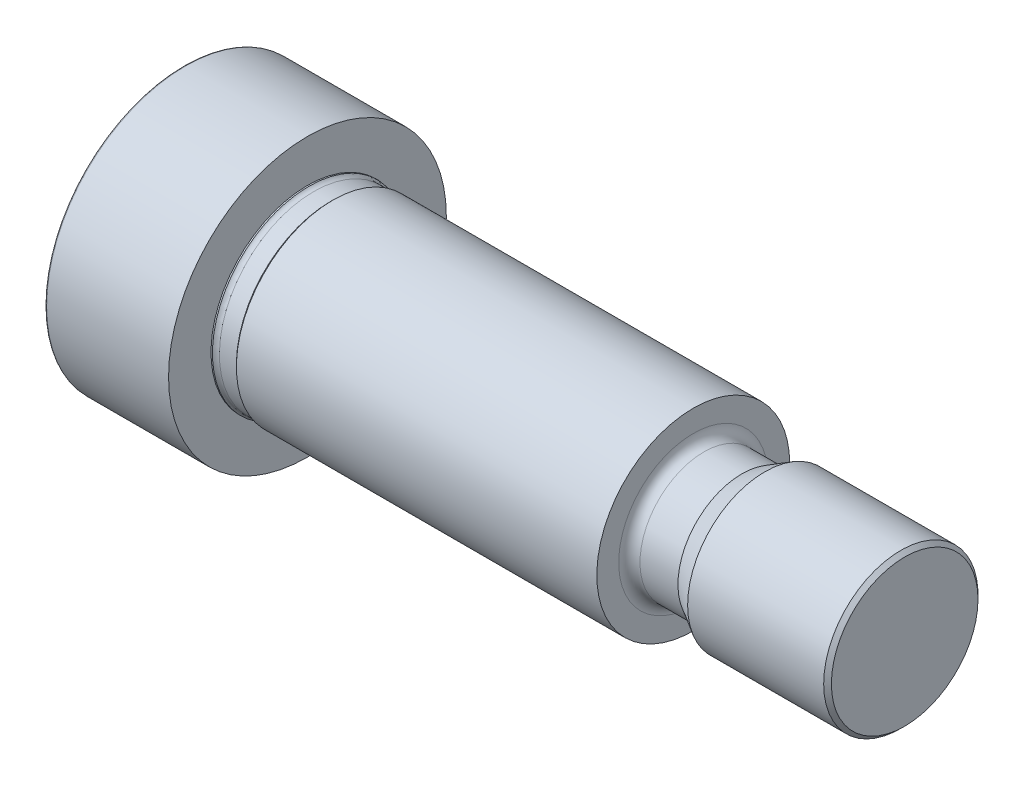
ISO-10303-21;
HEADER;
FILE_DESCRIPTION(('STEP AP214'),'2;1');
FILE_NAME('part.step','',(''),(''),'','','');
FILE_SCHEMA(('AUTOMOTIVE_DESIGN { 1 0 10303 214 1 1 1 1 }'));
ENDSEC;
DATA;
#1=APPLICATION_CONTEXT('core data for automotive mechanical design processes');
#2=APPLICATION_PROTOCOL_DEFINITION('international standard','automotive_design',2000,#1);
#3=PRODUCT_CONTEXT('',#1,'mechanical');
#4=PRODUCT('Part','Part','',(#3));
#5=PRODUCT_RELATED_PRODUCT_CATEGORY('part','',(#4));
#6=PRODUCT_DEFINITION_FORMATION('','',#4);
#7=PRODUCT_DEFINITION_CONTEXT('part definition',#1,'design');
#8=PRODUCT_DEFINITION('design','',#6,#7);
#9=PRODUCT_DEFINITION_SHAPE('','',#8);
#10=(LENGTH_UNIT() NAMED_UNIT(*) SI_UNIT(.MILLI.,.METRE.));
#11=(NAMED_UNIT(*) PLANE_ANGLE_UNIT() SI_UNIT($,.RADIAN.));
#12=(NAMED_UNIT(*) SI_UNIT($,.STERADIAN.) SOLID_ANGLE_UNIT());
#13=UNCERTAINTY_MEASURE_WITH_UNIT(LENGTH_MEASURE(1.E-05),#10,'distance_accuracy_value','');
#14=(GEOMETRIC_REPRESENTATION_CONTEXT(3) GLOBAL_UNCERTAINTY_ASSIGNED_CONTEXT((#13)) GLOBAL_UNIT_ASSIGNED_CONTEXT((#10,
#11,#12)) REPRESENTATION_CONTEXT('',''));
#15=CARTESIAN_POINT('',(0.,0.,0.));
#16=DIRECTION('',(0.,0.,1.));
#17=DIRECTION('',(1.,0.,0.));
#18=AXIS2_PLACEMENT_3D('',#15,#16,#17);
#19=CARTESIAN_POINT('',(48.433466155861,-3.65502053743683,-0.808965278217499));
#20=DIRECTION('',(-1.,0.,0.));
#21=DIRECTION('',(0.,0.,1.));
#22=AXIS2_PLACEMENT_3D('',#19,#20,#21);
#23=CYLINDRICAL_SURFACE('',#22,12.5);
#24=CARTESIAN_POINT('',(-1.38289412838843,-3.65502053743682,-0.808965278217499));
#25=DIRECTION('',(1.,0.,0.));
#26=DIRECTION('',(0.,1.,0.));
#27=AXIS2_PLACEMENT_3D('',#24,#25,#26);
#28=CIRCLE('',#27,12.5);
#29=CARTESIAN_POINT('',(-1.38289412838843,8.84497946256318,-0.808965278217499));
#30=VERTEX_POINT('',#29);
#31=EDGE_CURVE('E135',#30,#30,#28,.F.);
#32=ORIENTED_EDGE('',*,*,#31,.T.);
#33=EDGE_LOOP('',(#32));
#34=FACE_BOUND('',#33,.T.);
#35=CARTESIAN_POINT('',(-1.56653384413903,-3.65502053743683,-0.808965278217499));
#36=DIRECTION('',(1.,0.,0.));
#37=DIRECTION('',(0.,0.,-1.));
#38=AXIS2_PLACEMENT_3D('',#35,#36,#37);
#39=CIRCLE('',#38,12.5);
#40=CARTESIAN_POINT('',(-1.56653384413903,-3.65502053743683,-13.3089652782175));
#41=VERTEX_POINT('',#40);
#42=EDGE_CURVE('E111',#41,#41,#39,.T.);
#43=ORIENTED_EDGE('',*,*,#42,.T.);
#44=EDGE_LOOP('',(#43));
#45=FACE_BOUND('',#44,.T.);
#46=ADVANCED_FACE('F16',(#34,#45),#23,.T.);
#47=CARTESIAN_POINT('',(-17.566533844139,-3.65502053743683,-0.808965278217499));
#48=DIRECTION('',(1.,0.,0.));
#49=DIRECTION('',(0.,0.,-1.));
#50=AXIS2_PLACEMENT_3D('',#47,#48,#49);
#51=PLANE('',#50);
#52=CARTESIAN_POINT('',(-17.566533844139,-3.65502053743683,-0.808965278217499));
#53=DIRECTION('',(1.,0.,0.));
#54=DIRECTION('',(0.,0.,-1.));
#55=AXIS2_PLACEMENT_3D('',#52,#53,#54);
#56=CIRCLE('',#55,17.8);
#57=CARTESIAN_POINT('',(-17.566533844139,-3.65502053743683,-18.6089652782175));
#58=VERTEX_POINT('',#57);
#59=EDGE_CURVE('E10',#58,#58,#56,.F.);
#60=ORIENTED_EDGE('',*,*,#59,.T.);
#61=EDGE_LOOP('',(#60));
#62=FACE_BOUND('',#61,.T.);
#63=DIRECTION('',(0.,0.866025403784439,-0.5));
#64=VECTOR('',#63,1.);
#65=CARTESIAN_POINT('',(-17.566533844139,-9.65502053743683,-4.27306689335526));
#66=LINE('',#65,#64);
#67=CARTESIAN_POINT('',(-17.566533844139,-9.65502053743683,-4.27306689335526));
#68=VERTEX_POINT('',#67);
#69=CARTESIAN_POINT('',(-17.566533844139,-3.65502053743683,-7.73716850849301));
#70=VERTEX_POINT('',#69);
#71=EDGE_CURVE('E33',#68,#70,#66,.T.);
#72=ORIENTED_EDGE('',*,*,#71,.T.);
#73=DIRECTION('',(0.,0.866025403784438,0.5));
#74=VECTOR('',#73,1.);
#75=CARTESIAN_POINT('',(-17.566533844139,-3.65502053743683,-7.73716850849301));
#76=LINE('',#75,#74);
#77=CARTESIAN_POINT('',(-17.566533844139,2.34497946256317,-4.27306689335525));
#78=VERTEX_POINT('',#77);
#79=EDGE_CURVE('E93',#70,#78,#76,.T.);
#80=ORIENTED_EDGE('',*,*,#79,.T.);
#81=DIRECTION('',(0.,0.,1.));
#82=VECTOR('',#81,1.);
#83=CARTESIAN_POINT('',(-17.566533844139,2.34497946256317,-4.27306689335525));
#84=LINE('',#83,#82);
#85=CARTESIAN_POINT('',(-17.566533844139,2.34497946256317,2.65513633692025));
#86=VERTEX_POINT('',#85);
#87=EDGE_CURVE('E90',#78,#86,#84,.T.);
#88=ORIENTED_EDGE('',*,*,#87,.T.);
#89=DIRECTION('',(0.,-0.866025403784438,0.5));
#90=VECTOR('',#89,1.);
#91=CARTESIAN_POINT('',(-17.566533844139,2.34497946256317,2.65513633692025));
#92=LINE('',#91,#90);
#93=CARTESIAN_POINT('',(-17.566533844139,-3.65502053743683,6.11923795205801));
#94=VERTEX_POINT('',#93);
#95=EDGE_CURVE('E69',#86,#94,#92,.T.);
#96=ORIENTED_EDGE('',*,*,#95,.T.);
#97=DIRECTION('',(0.,-0.866025403784438,-0.5));
#98=VECTOR('',#97,1.);
#99=CARTESIAN_POINT('',(-17.566533844139,-3.65502053743683,6.11923795205801));
#100=LINE('',#99,#98);
#101=CARTESIAN_POINT('',(-17.566533844139,-9.65502053743682,2.65513633692025));
#102=VERTEX_POINT('',#101);
#103=EDGE_CURVE('E77',#94,#102,#100,.T.);
#104=ORIENTED_EDGE('',*,*,#103,.T.);
#105=DIRECTION('',(0.,0.,-1.));
#106=VECTOR('',#105,1.);
#107=CARTESIAN_POINT('',(-17.566533844139,-9.65502053743682,2.65513633692025));
#108=LINE('',#107,#106);
#109=EDGE_CURVE('E81',#102,#68,#108,.T.);
#110=ORIENTED_EDGE('',*,*,#109,.T.);
#111=EDGE_LOOP('',(#72,#80,#88,#96,#104,#110));
#112=FACE_BOUND('',#111,.T.);
#113=ADVANCED_FACE('F88',(#62,#112),#51,.F.);
#114=CARTESIAN_POINT('',(-1.56653384413903,-3.65502053743683,-0.808965278217499));
#115=DIRECTION('',(1.,0.,0.));
#116=DIRECTION('',(0.,0.,-1.));
#117=AXIS2_PLACEMENT_3D('',#114,#115,#116);
#118=PLANE('',#117);
#119=CARTESIAN_POINT('',(-1.56653384413903,-3.65502053743683,-0.808965278217499));
#120=DIRECTION('',(1.,0.,0.));
#121=DIRECTION('',(0.,0.,-1.));
#122=AXIS2_PLACEMENT_3D('',#119,#120,#121);
#123=CIRCLE('',#122,18.);
#124=CARTESIAN_POINT('',(-1.56653384413903,-3.65502053743683,-18.8089652782175));
#125=VERTEX_POINT('',#124);
#126=EDGE_CURVE('E114',#125,#125,#123,.T.);
#127=ORIENTED_EDGE('',*,*,#126,.T.);
#128=EDGE_LOOP('',(#127));
#129=FACE_BOUND('',#128,.T.);
#130=ORIENTED_EDGE('',*,*,#42,.F.);
#131=EDGE_LOOP('',(#130));
#132=FACE_BOUND('',#131,.T.);
#133=ADVANCED_FACE('F162',(#129,#132),#118,.T.);
#134=CARTESIAN_POINT('',(-1.56653384413903,-3.65502053743683,-0.808965278217499));
#135=DIRECTION('',(-1.,0.,0.));
#136=DIRECTION('',(0.,0.,1.));
#137=AXIS2_PLACEMENT_3D('',#134,#135,#136);
#138=CYLINDRICAL_SURFACE('',#137,18.);
#139=CARTESIAN_POINT('',(-17.366533844139,-3.65502053743683,-0.808965278217499));
#140=DIRECTION('',(1.,0.,0.));
#141=DIRECTION('',(0.,0.,-1.));
#142=AXIS2_PLACEMENT_3D('',#139,#140,#141);
#143=CIRCLE('',#142,18.);
#144=CARTESIAN_POINT('',(-17.366533844139,-3.65502053743683,-18.8089652782175));
#145=VERTEX_POINT('',#144);
#146=EDGE_CURVE('E24',#145,#145,#143,.T.);
#147=ORIENTED_EDGE('',*,*,#146,.T.);
#148=EDGE_LOOP('',(#147));
#149=FACE_BOUND('',#148,.T.);
#150=ORIENTED_EDGE('',*,*,#126,.F.);
#151=EDGE_LOOP('',(#150));
#152=FACE_BOUND('',#151,.T.);
#153=ADVANCED_FACE('F145',(#149,#152),#138,.T.);
#154=CARTESIAN_POINT('',(-7.56653384413903,-9.65502053743683,-4.27306689335526));
#155=DIRECTION('',(0.,0.5,0.866025403784439));
#156=DIRECTION('',(0.,-0.866025403784439,0.5));
#157=AXIS2_PLACEMENT_3D('',#154,#155,#156);
#158=PLANE('',#157);
#159=ORIENTED_EDGE('',*,*,#71,.F.);
#160=DIRECTION('',(-1.,0.,0.));
#161=VECTOR('',#160,1.);
#162=CARTESIAN_POINT('',(-7.56653384413903,-9.65502053743683,-4.27306689335526));
#163=LINE('',#162,#161);
#164=CARTESIAN_POINT('',(-7.56653384413903,-9.65502053743683,-4.27306689335526));
#165=VERTEX_POINT('',#164);
#166=EDGE_CURVE('E100',#165,#68,#163,.T.);
#167=ORIENTED_EDGE('',*,*,#166,.F.);
#168=DIRECTION('',(0.,0.866025403784439,-0.5));
#169=VECTOR('',#168,1.);
#170=CARTESIAN_POINT('',(-7.56653384413903,-9.65502053743683,-4.27306689335526));
#171=LINE('',#170,#169);
#172=CARTESIAN_POINT('',(-7.56653384413903,-3.65502053743683,-7.73716850849301));
#173=VERTEX_POINT('',#172);
#174=EDGE_CURVE('E96',#165,#173,#171,.T.);
#175=ORIENTED_EDGE('',*,*,#174,.T.);
#176=DIRECTION('',(-1.,0.,0.));
#177=VECTOR('',#176,1.);
#178=CARTESIAN_POINT('',(-7.56653384413903,-3.65502053743683,-7.73716850849301));
#179=LINE('',#178,#177);
#180=EDGE_CURVE('E102',#173,#70,#179,.T.);
#181=ORIENTED_EDGE('',*,*,#180,.T.);
#182=EDGE_LOOP('',(#159,#167,#175,#181));
#183=FACE_BOUND('',#182,.T.);
#184=ADVANCED_FACE('F236',(#183),#158,.T.);
#185=CARTESIAN_POINT('',(-7.56653384413903,-3.65502053743683,-7.73716850849301));
#186=DIRECTION('',(0.,-0.5,0.866025403784438));
#187=DIRECTION('',(0.,-0.866025403784439,-0.5));
#188=AXIS2_PLACEMENT_3D('',#185,#186,#187);
#189=PLANE('',#188);
#190=ORIENTED_EDGE('',*,*,#79,.F.);
#191=ORIENTED_EDGE('',*,*,#180,.F.);
#192=DIRECTION('',(0.,0.866025403784438,0.5));
#193=VECTOR('',#192,1.);
#194=CARTESIAN_POINT('',(-7.56653384413903,-3.65502053743683,-7.73716850849301));
#195=LINE('',#194,#193);
#196=CARTESIAN_POINT('',(-7.56653384413903,2.34497946256317,-4.27306689335525));
#197=VERTEX_POINT('',#196);
#198=EDGE_CURVE('E469',#173,#197,#195,.T.);
#199=ORIENTED_EDGE('',*,*,#198,.T.);
#200=DIRECTION('',(-1.,0.,0.));
#201=VECTOR('',#200,1.);
#202=CARTESIAN_POINT('',(-7.56653384413903,2.34497946256317,-4.27306689335525));
#203=LINE('',#202,#201);
#204=EDGE_CURVE('E105',#197,#78,#203,.T.);
#205=ORIENTED_EDGE('',*,*,#204,.T.);
#206=EDGE_LOOP('',(#190,#191,#199,#205));
#207=FACE_BOUND('',#206,.T.);
#208=ADVANCED_FACE('F232',(#207),#189,.T.);
#209=CARTESIAN_POINT('',(-7.56653384413903,2.34497946256317,-4.27306689335525));
#210=DIRECTION('',(0.,-1.,0.));
#211=DIRECTION('',(0.,0.,-1.));
#212=AXIS2_PLACEMENT_3D('',#209,#210,#211);
#213=PLANE('',#212);
#214=ORIENTED_EDGE('',*,*,#87,.F.);
#215=ORIENTED_EDGE('',*,*,#204,.F.);
#216=DIRECTION('',(0.,0.,1.));
#217=VECTOR('',#216,1.);
#218=CARTESIAN_POINT('',(-7.56653384413903,2.34497946256317,-4.27306689335525));
#219=LINE('',#218,#217);
#220=CARTESIAN_POINT('',(-7.56653384413903,2.34497946256317,2.65513633692025));
#221=VERTEX_POINT('',#220);
#222=EDGE_CURVE('E37',#197,#221,#219,.T.);
#223=ORIENTED_EDGE('',*,*,#222,.T.);
#224=DIRECTION('',(-1.,0.,0.));
#225=VECTOR('',#224,1.);
#226=CARTESIAN_POINT('',(-7.56653384413903,2.34497946256317,2.65513633692025));
#227=LINE('',#226,#225);
#228=EDGE_CURVE('E72',#221,#86,#227,.T.);
#229=ORIENTED_EDGE('',*,*,#228,.T.);
#230=EDGE_LOOP('',(#214,#215,#223,#229));
#231=FACE_BOUND('',#230,.T.);
#232=ADVANCED_FACE('F230',(#231),#213,.T.);
#233=CARTESIAN_POINT('',(-7.56653384413903,2.34497946256317,2.65513633692025));
#234=DIRECTION('',(0.,-0.5,-0.866025403784439));
#235=DIRECTION('',(0.,0.866025403784439,-0.5));
#236=AXIS2_PLACEMENT_3D('',#233,#234,#235);
#237=PLANE('',#236);
#238=ORIENTED_EDGE('',*,*,#95,.F.);
#239=ORIENTED_EDGE('',*,*,#228,.F.);
#240=DIRECTION('',(0.,-0.866025403784438,0.5));
#241=VECTOR('',#240,1.);
#242=CARTESIAN_POINT('',(-7.56653384413903,2.34497946256317,2.65513633692025));
#243=LINE('',#242,#241);
#244=CARTESIAN_POINT('',(-7.56653384413903,-3.65502053743683,6.11923795205801));
#245=VERTEX_POINT('',#244);
#246=EDGE_CURVE('E75',#221,#245,#243,.T.);
#247=ORIENTED_EDGE('',*,*,#246,.T.);
#248=DIRECTION('',(-1.,0.,0.));
#249=VECTOR('',#248,1.);
#250=CARTESIAN_POINT('',(-7.56653384413903,-3.65502053743683,6.11923795205801));
#251=LINE('',#250,#249);
#252=EDGE_CURVE('E62',#245,#94,#251,.T.);
#253=ORIENTED_EDGE('',*,*,#252,.T.);
#254=EDGE_LOOP('',(#238,#239,#247,#253));
#255=FACE_BOUND('',#254,.T.);
#256=ADVANCED_FACE('F63',(#255),#237,.T.);
#257=CARTESIAN_POINT('',(-7.56653384413903,-3.65502053743683,6.11923795205801));
#258=DIRECTION('',(0.,0.5,-0.866025403784438));
#259=DIRECTION('',(0.,0.866025403784438,0.5));
#260=AXIS2_PLACEMENT_3D('',#257,#258,#259);
#261=PLANE('',#260);
#262=ORIENTED_EDGE('',*,*,#103,.F.);
#263=ORIENTED_EDGE('',*,*,#252,.F.);
#264=DIRECTION('',(0.,-0.866025403784438,-0.5));
#265=VECTOR('',#264,1.);
#266=CARTESIAN_POINT('',(-7.56653384413903,-3.65502053743683,6.11923795205801));
#267=LINE('',#266,#265);
#268=CARTESIAN_POINT('',(-7.56653384413903,-9.65502053743682,2.65513633692025));
#269=VERTEX_POINT('',#268);
#270=EDGE_CURVE('E463',#245,#269,#267,.T.);
#271=ORIENTED_EDGE('',*,*,#270,.T.);
#272=DIRECTION('',(-1.,0.,0.));
#273=VECTOR('',#272,1.);
#274=CARTESIAN_POINT('',(-7.56653384413903,-9.65502053743682,2.65513633692025));
#275=LINE('',#274,#273);
#276=EDGE_CURVE('E74',#269,#102,#275,.T.);
#277=ORIENTED_EDGE('',*,*,#276,.T.);
#278=EDGE_LOOP('',(#262,#263,#271,#277));
#279=FACE_BOUND('',#278,.T.);
#280=ADVANCED_FACE('F78',(#279),#261,.T.);
#281=CARTESIAN_POINT('',(-7.56653384413903,-9.65502053743682,2.65513633692025));
#282=DIRECTION('',(0.,1.,0.));
#283=DIRECTION('',(0.,0.,1.));
#284=AXIS2_PLACEMENT_3D('',#281,#282,#283);
#285=PLANE('',#284);
#286=ORIENTED_EDGE('',*,*,#109,.F.);
#287=ORIENTED_EDGE('',*,*,#276,.F.);
#288=DIRECTION('',(0.,0.,-1.));
#289=VECTOR('',#288,1.);
#290=CARTESIAN_POINT('',(-7.56653384413903,-9.65502053743682,2.65513633692025));
#291=LINE('',#290,#289);
#292=EDGE_CURVE('E97',#269,#165,#291,.T.);
#293=ORIENTED_EDGE('',*,*,#292,.T.);
#294=ORIENTED_EDGE('',*,*,#166,.T.);
#295=EDGE_LOOP('',(#286,#287,#293,#294));
#296=FACE_BOUND('',#295,.T.);
#297=ADVANCED_FACE('F204',(#296),#285,.T.);
#298=CARTESIAN_POINT('',(-7.56653384413903,2.34497946256317,2.65513633692025));
#299=DIRECTION('',(0.86602540378444,0.249999999999999,0.433012701892218));
#300=DIRECTION('',(0.447213595499956,0.,-0.894427190999917));
#301=AXIS2_PLACEMENT_3D('',#298,#299,#300);
#302=PLANE('',#301);
#303=ORIENTED_EDGE('',*,*,#246,.F.);
#304=DIRECTION('',(-0.447213595499956,0.774596669241484,0.447213595499958));
#305=VECTOR('',#304,1.);
#306=CARTESIAN_POINT('',(-7.56653384413903,2.34497946256317,2.65513633692025));
#307=LINE('',#306,#305);
#308=CARTESIAN_POINT('',(-4.10243222900129,-3.65502053743683,-0.808965278217502));
#309=VERTEX_POINT('',#308);
#310=EDGE_CURVE('E137',#309,#221,#307,.T.);
#311=ORIENTED_EDGE('',*,*,#310,.F.);
#312=DIRECTION('',(-0.447213595499956,0.,0.894427190999917));
#313=VECTOR('',#312,1.);
#314=CARTESIAN_POINT('',(-7.56653384413903,-3.65502053743683,6.11923795205801));
#315=LINE('',#314,#313);
#316=EDGE_CURVE('E460',#309,#245,#315,.T.);
#317=ORIENTED_EDGE('',*,*,#316,.T.);
#318=EDGE_LOOP('',(#303,#311,#317));
#319=FACE_BOUND('',#318,.T.);
#320=ADVANCED_FACE('F199',(#319),#302,.F.);
#321=CARTESIAN_POINT('',(-7.56653384413903,-3.65502053743683,6.11923795205801));
#322=DIRECTION('',(0.86602540378444,-0.249999999999999,0.433012701892218));
#323=DIRECTION('',(0.447213595499956,0.,-0.894427190999917));
#324=AXIS2_PLACEMENT_3D('',#321,#322,#323);
#325=PLANE('',#324);
#326=ORIENTED_EDGE('',*,*,#270,.F.);
#327=ORIENTED_EDGE('',*,*,#316,.F.);
#328=DIRECTION('',(-0.447213595499956,-0.774596669241484,0.447213595499958));
#329=VECTOR('',#328,1.);
#330=CARTESIAN_POINT('',(-7.56653384413903,-9.65502053743682,2.65513633692025));
#331=LINE('',#330,#329);
#332=EDGE_CURVE('E457',#309,#269,#331,.T.);
#333=ORIENTED_EDGE('',*,*,#332,.T.);
#334=EDGE_LOOP('',(#326,#327,#333));
#335=FACE_BOUND('',#334,.T.);
#336=ADVANCED_FACE('F201',(#335),#325,.F.);
#337=CARTESIAN_POINT('',(-7.56653384413903,-9.65502053743682,2.65513633692025));
#338=DIRECTION('',(0.86602540378444,-0.499999999999998,0.));
#339=DIRECTION('',(0.499999999999998,0.86602540378444,0.));
#340=AXIS2_PLACEMENT_3D('',#337,#338,#339);
#341=PLANE('',#340);
#342=ORIENTED_EDGE('',*,*,#292,.F.);
#343=ORIENTED_EDGE('',*,*,#332,.F.);
#344=DIRECTION('',(-0.447213595499956,-0.774596669241484,-0.447213595499958));
#345=VECTOR('',#344,1.);
#346=CARTESIAN_POINT('',(-7.56653384413903,-9.65502053743683,-4.27306689335526));
#347=LINE('',#346,#345);
#348=EDGE_CURVE('E471',#309,#165,#347,.T.);
#349=ORIENTED_EDGE('',*,*,#348,.T.);
#350=EDGE_LOOP('',(#342,#343,#349));
#351=FACE_BOUND('',#350,.T.);
#352=ADVANCED_FACE('F214',(#351),#341,.F.);
#353=CARTESIAN_POINT('',(-7.56653384413903,-9.65502053743683,-4.27306689335526));
#354=DIRECTION('',(0.86602540378444,-0.249999999999999,-0.433012701892218));
#355=DIRECTION('',(-0.447213595499956,0.,-0.894427190999917));
#356=AXIS2_PLACEMENT_3D('',#353,#354,#355);
#357=PLANE('',#356);
#358=ORIENTED_EDGE('',*,*,#174,.F.);
#359=ORIENTED_EDGE('',*,*,#348,.F.);
#360=DIRECTION('',(-0.447213595499956,0.,-0.894427190999917));
#361=VECTOR('',#360,1.);
#362=CARTESIAN_POINT('',(-7.56653384413903,-3.65502053743683,-7.73716850849301));
#363=LINE('',#362,#361);
#364=EDGE_CURVE('E478',#309,#173,#363,.T.);
#365=ORIENTED_EDGE('',*,*,#364,.T.);
#366=EDGE_LOOP('',(#358,#359,#365));
#367=FACE_BOUND('',#366,.T.);
#368=ADVANCED_FACE('F211',(#367),#357,.F.);
#369=CARTESIAN_POINT('',(-7.56653384413903,-3.65502053743683,-7.73716850849301));
#370=DIRECTION('',(0.86602540378444,0.249999999999999,-0.433012701892217));
#371=DIRECTION('',(-0.447213595499956,0.,-0.894427190999917));
#372=AXIS2_PLACEMENT_3D('',#369,#370,#371);
#373=PLANE('',#372);
#374=ORIENTED_EDGE('',*,*,#198,.F.);
#375=ORIENTED_EDGE('',*,*,#364,.F.);
#376=DIRECTION('',(-0.447213595499956,0.774596669241484,-0.447213595499958));
#377=VECTOR('',#376,1.);
#378=CARTESIAN_POINT('',(-7.56653384413903,2.34497946256317,-4.27306689335525));
#379=LINE('',#378,#377);
#380=EDGE_CURVE('E479',#309,#197,#379,.T.);
#381=ORIENTED_EDGE('',*,*,#380,.T.);
#382=EDGE_LOOP('',(#374,#375,#381));
#383=FACE_BOUND('',#382,.T.);
#384=ADVANCED_FACE('F208',(#383),#373,.F.);
#385=CARTESIAN_POINT('',(-7.56653384413903,2.34497946256317,-4.27306689335525));
#386=DIRECTION('',(0.86602540378444,0.499999999999998,0.));
#387=DIRECTION('',(-0.499999999999998,0.86602540378444,0.));
#388=AXIS2_PLACEMENT_3D('',#385,#386,#387);
#389=PLANE('',#388);
#390=ORIENTED_EDGE('',*,*,#222,.F.);
#391=ORIENTED_EDGE('',*,*,#380,.F.);
#392=ORIENTED_EDGE('',*,*,#310,.T.);
#393=EDGE_LOOP('',(#390,#391,#392));
#394=FACE_BOUND('',#393,.T.);
#395=ADVANCED_FACE('F193',(#394),#389,.F.);
#396=CARTESIAN_POINT('',(-0.766533844139029,-3.65502053743682,-0.808965278217499));
#397=DIRECTION('',(1.,0.,0.));
#398=DIRECTION('',(0.,1.,0.));
#399=AXIS2_PLACEMENT_3D('',#396,#397,#398);
#400=TOROIDAL_SURFACE('',#399,13.01,0.799999999999999);
#401=CARTESIAN_POINT('',(-0.766533844139029,-3.65502053743682,-0.808965278217499));
#402=DIRECTION('',(1.,0.,0.));
#403=DIRECTION('',(0.,1.,0.));
#404=AXIS2_PLACEMENT_3D('',#401,#402,#403);
#405=CIRCLE('',#404,12.21);
#406=CARTESIAN_POINT('',(-0.766533844139031,8.55497946256317,-0.808965278217499));
#407=VERTEX_POINT('',#406);
#408=EDGE_CURVE('E132',#407,#407,#405,.T.);
#409=ORIENTED_EDGE('',*,*,#408,.F.);
#410=EDGE_LOOP('',(#409));
#411=FACE_BOUND('',#410,.T.);
#412=ORIENTED_EDGE('',*,*,#31,.F.);
#413=EDGE_LOOP('',(#412));
#414=FACE_BOUND('',#413,.T.);
#415=ADVANCED_FACE('F184',(#411,#414),#400,.F.);
#416=CARTESIAN_POINT('',(1.43346615586097,-3.65502053743682,-0.808965278217499));
#417=DIRECTION('',(1.,0.,0.));
#418=DIRECTION('',(0.,1.,0.));
#419=AXIS2_PLACEMENT_3D('',#416,#417,#418);
#420=CONICAL_SURFACE('',#419,12.21,0.785398163397448);
#421=CARTESIAN_POINT('',(1.43346615586097,-3.65502053743682,-0.808965278217499));
#422=DIRECTION('',(1.,0.,0.));
#423=DIRECTION('',(0.,1.,0.));
#424=AXIS2_PLACEMENT_3D('',#421,#422,#423);
#425=CIRCLE('',#424,12.21);
#426=CARTESIAN_POINT('',(1.43346615586097,8.55497946256317,-0.808965278217499));
#427=VERTEX_POINT('',#426);
#428=EDGE_CURVE('E482',#427,#427,#425,.T.);
#429=ORIENTED_EDGE('',*,*,#428,.T.);
#430=EDGE_LOOP('',(#429));
#431=FACE_BOUND('',#430,.T.);
#432=CARTESIAN_POINT('',(1.72346615586097,-3.65502053743682,-0.808965278217499));
#433=DIRECTION('',(1.,0.,0.));
#434=DIRECTION('',(0.,1.,0.));
#435=AXIS2_PLACEMENT_3D('',#432,#433,#434);
#436=CIRCLE('',#435,12.5);
#437=CARTESIAN_POINT('',(1.72346615586097,8.84497946256318,-0.808965278217499));
#438=VERTEX_POINT('',#437);
#439=EDGE_CURVE('E127',#438,#438,#436,.T.);
#440=ORIENTED_EDGE('',*,*,#439,.F.);
#441=EDGE_LOOP('',(#440));
#442=FACE_BOUND('',#441,.T.);
#443=ADVANCED_FACE('F181',(#431,#442),#420,.T.);
#444=CARTESIAN_POINT('',(-5.03446972460359,-3.65502053743682,-0.808965278217499));
#445=DIRECTION('',(1.,0.,0.));
#446=DIRECTION('',(0.,1.,0.));
#447=AXIS2_PLACEMENT_3D('',#444,#445,#446);
#448=CYLINDRICAL_SURFACE('',#447,12.21);
#449=ORIENTED_EDGE('',*,*,#428,.F.);
#450=EDGE_LOOP('',(#449));
#451=FACE_BOUND('',#450,.T.);
#452=ORIENTED_EDGE('',*,*,#408,.T.);
#453=EDGE_LOOP('',(#452));
#454=FACE_BOUND('',#453,.T.);
#455=ADVANCED_FACE('F182',(#451,#454),#448,.T.);
#456=CARTESIAN_POINT('',(75.833466155861,-3.65502053743683,-0.808965278217499));
#457=DIRECTION('',(1.,0.,0.));
#458=DIRECTION('',(0.,0.,-1.));
#459=AXIS2_PLACEMENT_3D('',#456,#457,#458);
#460=PLANE('',#459);
#461=CARTESIAN_POINT('',(75.833466155861,-3.65502053743683,-0.808965278217499));
#462=DIRECTION('',(1.,0.,0.));
#463=DIRECTION('',(0.,0.,-1.));
#464=AXIS2_PLACEMENT_3D('',#461,#462,#463);
#465=CIRCLE('',#464,9.50000000000006);
#466=CARTESIAN_POINT('',(75.833466155861,-3.65502053743683,-10.3089652782176));
#467=VERTEX_POINT('',#466);
#468=EDGE_CURVE('E128',#467,#467,#465,.T.);
#469=ORIENTED_EDGE('',*,*,#468,.T.);
#470=EDGE_LOOP('',(#469));
#471=FACE_BOUND('',#470,.T.);
#472=ADVANCED_FACE('F195',(#471),#460,.T.);
#473=CARTESIAN_POINT('',(75.833466155861,-3.65502053743683,-0.808965278217499));
#474=DIRECTION('',(-1.,0.,0.));
#475=DIRECTION('',(0.,0.,1.));
#476=AXIS2_PLACEMENT_3D('',#473,#474,#475);
#477=CYLINDRICAL_SURFACE('',#476,10.);
#478=CARTESIAN_POINT('',(75.333466155861,-3.65502053743683,-0.808965278217499));
#479=DIRECTION('',(1.,0.,0.));
#480=DIRECTION('',(0.,0.,-1.));
#481=AXIS2_PLACEMENT_3D('',#478,#479,#480);
#482=CIRCLE('',#481,10.);
#483=CARTESIAN_POINT('',(75.333466155861,-3.65502053743683,9.1910347217825));
#484=VERTEX_POINT('',#483);
#485=EDGE_CURVE('E136',#484,#484,#482,.F.);
#486=CARTESIAN_POINT('',(57.7039332908416,-3.65502053743681,-0.808965278217499));
#487=DIRECTION('',(1.,0.,0.));
#488=DIRECTION('',(0.,1.,0.));
#489=AXIS2_PLACEMENT_3D('',#486,#487,#488);
#490=CIRCLE('',#489,10.);
#491=CARTESIAN_POINT('',(57.7039332908416,-3.65502053743683,9.1910347217825));
#492=VERTEX_POINT('',#491);
#493=EDGE_CURVE('E108',#492,#492,#490,.T.);
#494=CARTESIAN_POINT('',(75.333466155861,-3.65502053743683,9.1910347217825));
#495=CARTESIAN_POINT('',(75.1498251885171,-3.65502053743683,9.1910347217825));
#496=CARTESIAN_POINT('',(74.9661842211731,-3.65502053743683,9.1910347217825));
#497=CARTESIAN_POINT('',(74.5989022864852,-3.65502053743683,9.1910347217825));
#498=CARTESIAN_POINT('',(74.4152613191413,-3.65502053743683,9.1910347217825));
#499=CARTESIAN_POINT('',(74.0479793844533,-3.65502053743683,9.1910347217825));
#500=CARTESIAN_POINT('',(73.8643384171094,-3.65502053743683,9.1910347217825));
#501=CARTESIAN_POINT('',(73.4970564824215,-3.65502053743683,9.1910347217825));
#502=CARTESIAN_POINT('',(73.3134155150775,-3.65502053743683,9.1910347217825));
#503=CARTESIAN_POINT('',(72.9461335803896,-3.65502053743683,9.1910347217825));
#504=CARTESIAN_POINT('',(72.7624926130457,-3.65502053743683,9.1910347217825));
#505=CARTESIAN_POINT('',(72.3952106783578,-3.65502053743683,9.1910347217825));
#506=CARTESIAN_POINT('',(72.2115697110138,-3.65502053743683,9.1910347217825));
#507=CARTESIAN_POINT('',(71.8442877763259,-3.65502053743683,9.1910347217825));
#508=CARTESIAN_POINT('',(71.660646808982,-3.65502053743683,9.1910347217825));
#509=CARTESIAN_POINT('',(71.2933648742941,-3.65502053743683,9.1910347217825));
#510=CARTESIAN_POINT('',(71.1097239069501,-3.65502053743683,9.1910347217825));
#511=CARTESIAN_POINT('',(70.7424419722622,-3.65502053743683,9.1910347217825));
#512=CARTESIAN_POINT('',(70.5588010049183,-3.65502053743683,9.1910347217825));
#513=CARTESIAN_POINT('',(70.1915190702304,-3.65502053743683,9.1910347217825));
#514=CARTESIAN_POINT('',(70.0078781028864,-3.65502053743683,9.1910347217825));
#515=CARTESIAN_POINT('',(69.6405961681985,-3.65502053743683,9.1910347217825));
#516=CARTESIAN_POINT('',(69.4569552008546,-3.65502053743683,9.1910347217825));
#517=CARTESIAN_POINT('',(69.0896732661666,-3.65502053743683,9.1910347217825));
#518=CARTESIAN_POINT('',(68.9060322988227,-3.65502053743683,9.1910347217825));
#519=CARTESIAN_POINT('',(68.5387503641348,-3.65502053743683,9.1910347217825));
#520=CARTESIAN_POINT('',(68.3551093967909,-3.65502053743683,9.1910347217825));
#521=CARTESIAN_POINT('',(67.9878274621029,-3.65502053743683,9.1910347217825));
#522=CARTESIAN_POINT('',(67.804186494759,-3.65502053743683,9.1910347217825));
#523=CARTESIAN_POINT('',(67.4369045600711,-3.65502053743683,9.1910347217825));
#524=CARTESIAN_POINT('',(67.2532635927271,-3.65502053743683,9.1910347217825));
#525=CARTESIAN_POINT('',(66.8859816580392,-3.65502053743683,9.1910347217825));
#526=CARTESIAN_POINT('',(66.7023406906953,-3.65502053743683,9.1910347217825));
#527=CARTESIAN_POINT('',(66.3350587560074,-3.65502053743683,9.1910347217825));
#528=CARTESIAN_POINT('',(66.1514177886634,-3.65502053743683,9.1910347217825));
#529=CARTESIAN_POINT('',(65.7841358539755,-3.65502053743683,9.1910347217825));
#530=CARTESIAN_POINT('',(65.6004948866316,-3.65502053743683,9.1910347217825));
#531=CARTESIAN_POINT('',(65.2332129519437,-3.65502053743683,9.1910347217825));
#532=CARTESIAN_POINT('',(65.0495719845997,-3.65502053743683,9.1910347217825));
#533=CARTESIAN_POINT('',(64.6822900499118,-3.65502053743683,9.1910347217825));
#534=CARTESIAN_POINT('',(64.4986490825679,-3.65502053743683,9.1910347217825));
#535=CARTESIAN_POINT('',(64.13136714788,-3.65502053743683,9.1910347217825));
#536=CARTESIAN_POINT('',(63.947726180536,-3.65502053743683,9.1910347217825));
#537=CARTESIAN_POINT('',(63.5804442458481,-3.65502053743683,9.1910347217825));
#538=CARTESIAN_POINT('',(63.3968032785042,-3.65502053743683,9.1910347217825));
#539=CARTESIAN_POINT('',(63.0295213438162,-3.65502053743683,9.1910347217825));
#540=CARTESIAN_POINT('',(62.8458803764723,-3.65502053743683,9.1910347217825));
#541=CARTESIAN_POINT('',(62.4785984417844,-3.65502053743683,9.1910347217825));
#542=CARTESIAN_POINT('',(62.2949574744404,-3.65502053743683,9.1910347217825));
#543=CARTESIAN_POINT('',(61.9276755397525,-3.65502053743683,9.1910347217825));
#544=CARTESIAN_POINT('',(61.7440345724086,-3.65502053743683,9.1910347217825));
#545=CARTESIAN_POINT('',(61.3767526377207,-3.65502053743683,9.1910347217825));
#546=CARTESIAN_POINT('',(61.1931116703767,-3.65502053743683,9.1910347217825));
#547=CARTESIAN_POINT('',(60.8258297356888,-3.65502053743683,9.1910347217825));
#548=CARTESIAN_POINT('',(60.6421887683449,-3.65502053743683,9.1910347217825));
#549=CARTESIAN_POINT('',(60.274906833657,-3.65502053743683,9.1910347217825));
#550=CARTESIAN_POINT('',(60.091265866313,-3.65502053743683,9.1910347217825));
#551=CARTESIAN_POINT('',(59.7239839316251,-3.65502053743683,9.1910347217825));
#552=CARTESIAN_POINT('',(59.5403429642812,-3.65502053743683,9.1910347217825));
#553=CARTESIAN_POINT('',(59.1730610295933,-3.65502053743683,9.1910347217825));
#554=CARTESIAN_POINT('',(58.9894200622493,-3.65502053743683,9.1910347217825));
#555=CARTESIAN_POINT('',(58.6221381275614,-3.65502053743683,9.1910347217825));
#556=CARTESIAN_POINT('',(58.4384971602175,-3.65502053743683,9.1910347217825));
#557=CARTESIAN_POINT('',(58.0712152255295,-3.65502053743683,9.1910347217825));
#558=CARTESIAN_POINT('',(57.8875742581856,-3.65502053743683,9.1910347217825));
#559=CARTESIAN_POINT('',(57.7039332908416,-3.65502053743683,9.1910347217825));
#560=B_SPLINE_CURVE_WITH_KNOTS('',3,(#494,#495,#496,#497,#498,#499,#500,#501,#502,#503,#504,
#505,#506,#507,#508,#509,#510,#511,#512,#513,#514,#515,#516,#517,#518,#519,#520,#521,#522,#523,
#524,#525,#526,#527,#528,#529,#530,#531,#532,#533,#534,#535,#536,#537,#538,#539,#540,#541,#542,
#543,#544,#545,#546,#547,#548,#549,#550,#551,#552,#553,#554,#555,#556,#557,#558,#559),
.UNSPECIFIED.,.F.,.F.,(4,2,2,2,2,2,2,2,2,2,2,2,2,2,2,2,2,2,2,2,2,2,2,2,2,2,2,2,2,2,2,2,4),(0.,
0.550922902031861,1.10184580406372,1.65276870609557,2.20369160812743,2.75461451015928,
3.30553741219114,3.856460314223,4.40738321625485,4.95830611828671,5.50922902031856,
6.06015192235042,6.61107482438227,7.16199772641413,7.71292062844599,8.26384353047784,
8.8147664325097,9.36568933454154,9.91661223657341,10.4675351386053,11.0184580406371,
11.569380942669,12.1203038447008,12.6712267467327,13.2221496487645,13.7730725507964,
14.3239954528282,14.8749183548601,15.425841256892,15.9767641589238,16.5276870609557,
17.0786099629875,17.6295328650194),.UNSPECIFIED.);
#561=EDGE_CURVE('BSEAM244',#484,#492,#560,.T.);
#562=ORIENTED_EDGE('',*,*,#485,.T.);
#563=ORIENTED_EDGE('',*,*,#493,.T.);
#564=ORIENTED_EDGE('',*,*,#561,.T.);
#565=ORIENTED_EDGE('',*,*,#561,.F.);
#566=EDGE_LOOP('',(#562,#564,#563,#565));
#567=FACE_BOUND('',#566,.T.);
#568=ADVANCED_FACE('F244',(#567),#477,.T.);
#569=CARTESIAN_POINT('',(54.733466155861,-3.65502053743681,-0.808965278217499));
#570=DIRECTION('',(1.,0.,0.));
#571=DIRECTION('',(0.,1.,0.));
#572=AXIS2_PLACEMENT_3D('',#569,#570,#571);
#573=CONICAL_SURFACE('',#572,8.285,0.523598775598293);
#574=CARTESIAN_POINT('',(54.733466155861,-3.65502053743681,-0.808965278217499));
#575=DIRECTION('',(1.,0.,0.));
#576=DIRECTION('',(0.,1.,0.));
#577=AXIS2_PLACEMENT_3D('',#574,#575,#576);
#578=CIRCLE('',#577,8.285);
#579=CARTESIAN_POINT('',(54.733466155861,4.62997946256318,-0.808965278217499));
#580=VERTEX_POINT('',#579);
#581=EDGE_CURVE('E106',#580,#580,#578,.T.);
#582=ORIENTED_EDGE('',*,*,#581,.T.);
#583=EDGE_LOOP('',(#582));
#584=FACE_BOUND('',#583,.T.);
#585=ORIENTED_EDGE('',*,*,#493,.F.);
#586=EDGE_LOOP('',(#585));
#587=FACE_BOUND('',#586,.T.);
#588=ADVANCED_FACE('F241',(#584,#587),#573,.T.);
#589=CARTESIAN_POINT('',(-4.53850315545865,-3.65502053743682,-0.808965278217499));
#590=DIRECTION('',(1.,0.,0.));
#591=DIRECTION('',(0.,1.,0.));
#592=AXIS2_PLACEMENT_3D('',#589,#590,#591);
#593=CYLINDRICAL_SURFACE('',#592,8.285);
#594=CARTESIAN_POINT('',(49.813466155861,-3.65502053743682,-0.808965278217499));
#595=DIRECTION('',(1.,0.,0.));
#596=DIRECTION('',(0.,0.,-1.));
#597=AXIS2_PLACEMENT_3D('',#594,#595,#596);
#598=CIRCLE('',#597,8.285);
#599=CARTESIAN_POINT('',(49.813466155861,-3.65502053743682,-9.0939652782175));
#600=VERTEX_POINT('',#599);
#601=EDGE_CURVE('E120',#600,#600,#598,.T.);
#602=ORIENTED_EDGE('',*,*,#601,.T.);
#603=EDGE_LOOP('',(#602));
#604=FACE_BOUND('',#603,.T.);
#605=ORIENTED_EDGE('',*,*,#581,.F.);
#606=EDGE_LOOP('',(#605));
#607=FACE_BOUND('',#606,.T.);
#608=ADVANCED_FACE('F243',(#604,#607),#593,.T.);
#609=CARTESIAN_POINT('',(49.813466155861,-3.65502053743682,-0.808965278217499));
#610=DIRECTION('',(1.,0.,0.));
#611=DIRECTION('',(0.,0.,-1.));
#612=AXIS2_PLACEMENT_3D('',#609,#610,#611);
#613=TOROIDAL_SURFACE('',#612,9.665,1.38);
#614=CARTESIAN_POINT('',(48.433466155861,-3.65502053743682,-0.808965278217499));
#615=DIRECTION('',(1.,0.,0.));
#616=DIRECTION('',(0.,0.,-1.));
#617=AXIS2_PLACEMENT_3D('',#614,#615,#616);
#618=CIRCLE('',#617,9.665);
#619=CARTESIAN_POINT('',(48.433466155861,-3.65502053743682,-10.4739652782175));
#620=VERTEX_POINT('',#619);
#621=EDGE_CURVE('E121',#620,#620,#618,.F.);
#622=ORIENTED_EDGE('',*,*,#621,.F.);
#623=EDGE_LOOP('',(#622));
#624=FACE_BOUND('',#623,.T.);
#625=ORIENTED_EDGE('',*,*,#601,.F.);
#626=EDGE_LOOP('',(#625));
#627=FACE_BOUND('',#626,.T.);
#628=ADVANCED_FACE('F175',(#624,#627),#613,.F.);
#629=CARTESIAN_POINT('',(48.433466155861,-3.65502053743683,-0.808965278217499));
#630=DIRECTION('',(1.,0.,0.));
#631=DIRECTION('',(0.,0.,-1.));
#632=AXIS2_PLACEMENT_3D('',#629,#630,#631);
#633=PLANE('',#632);
#634=ORIENTED_EDGE('',*,*,#621,.T.);
#635=EDGE_LOOP('',(#634));
#636=FACE_BOUND('',#635,.T.);
#637=CARTESIAN_POINT('',(48.433466155861,-3.65502053743683,-0.808965278217499));
#638=DIRECTION('',(1.,0.,0.));
#639=DIRECTION('',(0.,0.,-1.));
#640=AXIS2_PLACEMENT_3D('',#637,#638,#639);
#641=CIRCLE('',#640,12.5);
#642=CARTESIAN_POINT('',(48.433466155861,-3.65502053743683,-13.3089652782175));
#643=VERTEX_POINT('',#642);
#644=EDGE_CURVE('E109',#643,#643,#641,.T.);
#645=ORIENTED_EDGE('',*,*,#644,.T.);
#646=EDGE_LOOP('',(#645));
#647=FACE_BOUND('',#646,.T.);
#648=ADVANCED_FACE('F168',(#636,#647),#633,.T.);
#649=ORIENTED_EDGE('',*,*,#439,.T.);
#650=EDGE_LOOP('',(#649));
#651=FACE_BOUND('',#650,.T.);
#652=ORIENTED_EDGE('',*,*,#644,.F.);
#653=EDGE_LOOP('',(#652));
#654=FACE_BOUND('',#653,.T.);
#655=ADVANCED_FACE('F152',(#651,#654),#23,.T.);
#656=CARTESIAN_POINT('',(75.833466155861,-3.65502053743683,-0.808965278217499));
#657=DIRECTION('',(-1.,0.,0.));
#658=DIRECTION('',(0.,0.,1.));
#659=AXIS2_PLACEMENT_3D('',#656,#657,#658);
#660=CONICAL_SURFACE('',#659,9.50000000000006,0.785398163397441);
#661=ORIENTED_EDGE('',*,*,#485,.F.);
#662=EDGE_LOOP('',(#661));
#663=FACE_BOUND('',#662,.T.);
#664=ORIENTED_EDGE('',*,*,#468,.F.);
#665=EDGE_LOOP('',(#664));
#666=FACE_BOUND('',#665,.T.);
#667=ADVANCED_FACE('F146',(#663,#666),#660,.T.);
#668=CARTESIAN_POINT('',(-17.366533844139,-3.65502053743683,-0.808965278217499));
#669=DIRECTION('',(1.,0.,0.));
#670=DIRECTION('',(0.,0.,-1.));
#671=AXIS2_PLACEMENT_3D('',#668,#669,#670);
#672=TOROIDAL_SURFACE('',#671,17.8,0.2);
#673=ORIENTED_EDGE('',*,*,#59,.F.);
#674=EDGE_LOOP('',(#673));
#675=FACE_BOUND('',#674,.T.);
#676=ORIENTED_EDGE('',*,*,#146,.F.);
#677=EDGE_LOOP('',(#676));
#678=FACE_BOUND('',#677,.T.);
#679=ADVANCED_FACE('F18',(#675,#678),#672,.T.);
#680=CLOSED_SHELL('',(#46,#113,#133,#153,#184,#208,#232,#256,#280,#297,#320,#336,#352,#368,#384,
#395,#415,#443,#455,#472,#568,#588,#608,#628,#648,#655,#667,#679));
#681=MANIFOLD_SOLID_BREP('B1',#680);
#682=ADVANCED_BREP_SHAPE_REPRESENTATION('',(#18,#681),#14);
#683=SHAPE_DEFINITION_REPRESENTATION(#9,#682);
ENDSEC;
END-ISO-10303-21;
